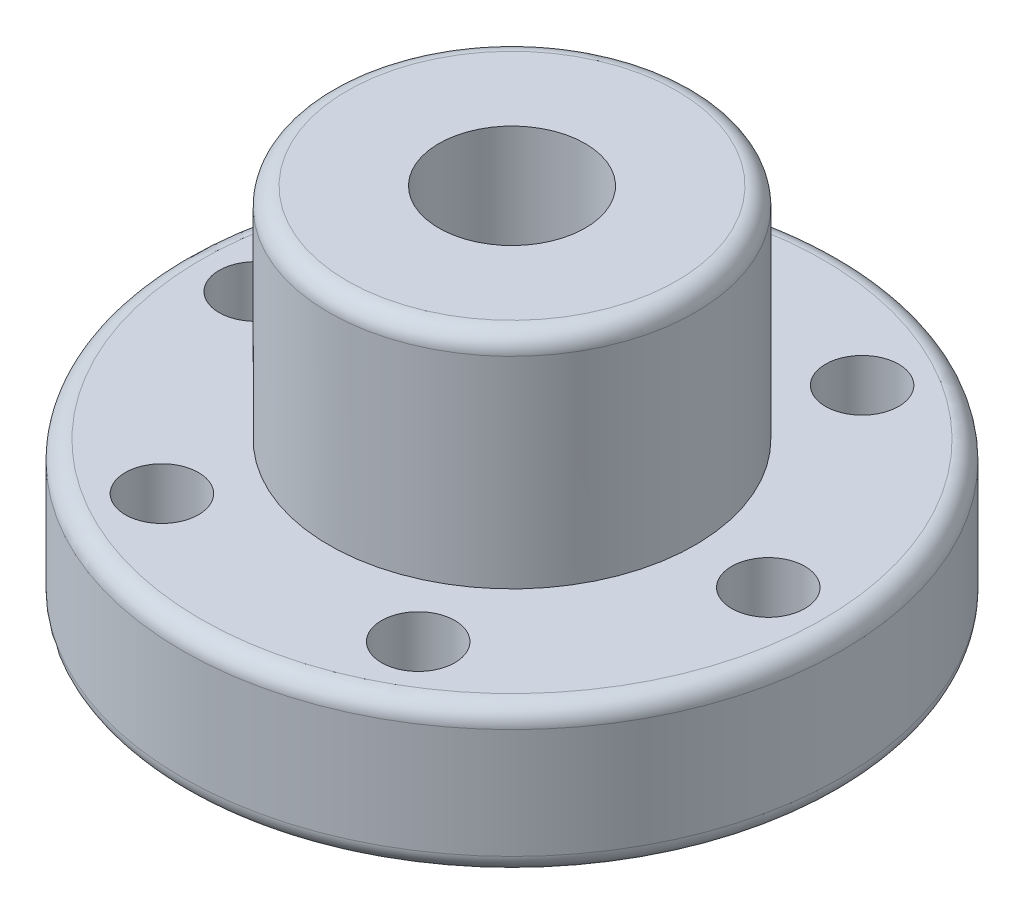
ISO-10303-21;
HEADER;
FILE_DESCRIPTION(('STEP AP214'),'2;1');
FILE_NAME('part.step','',(''),(''),'','','');
FILE_SCHEMA(('AUTOMOTIVE_DESIGN { 1 0 10303 214 1 1 1 1 }'));
ENDSEC;
DATA;
#1=APPLICATION_CONTEXT('core data for automotive mechanical design processes');
#2=APPLICATION_PROTOCOL_DEFINITION('international standard','automotive_design',2000,#1);
#3=PRODUCT_CONTEXT('',#1,'mechanical');
#4=PRODUCT('Part','Part','',(#3));
#5=PRODUCT_RELATED_PRODUCT_CATEGORY('part','',(#4));
#6=PRODUCT_DEFINITION_FORMATION('','',#4);
#7=PRODUCT_DEFINITION_CONTEXT('part definition',#1,'design');
#8=PRODUCT_DEFINITION('design','',#6,#7);
#9=PRODUCT_DEFINITION_SHAPE('','',#8);
#10=(LENGTH_UNIT() NAMED_UNIT(*) SI_UNIT(.MILLI.,.METRE.));
#11=(NAMED_UNIT(*) PLANE_ANGLE_UNIT() SI_UNIT($,.RADIAN.));
#12=(NAMED_UNIT(*) SI_UNIT($,.STERADIAN.) SOLID_ANGLE_UNIT());
#13=UNCERTAINTY_MEASURE_WITH_UNIT(LENGTH_MEASURE(1.E-05),#10,'distance_accuracy_value','');
#14=(GEOMETRIC_REPRESENTATION_CONTEXT(3) GLOBAL_UNCERTAINTY_ASSIGNED_CONTEXT((#13)) GLOBAL_UNIT_ASSIGNED_CONTEXT((#10,
#11,#12)) REPRESENTATION_CONTEXT('',''));
#15=CARTESIAN_POINT('',(0.,0.,0.));
#16=DIRECTION('',(0.,0.,1.));
#17=DIRECTION('',(1.,0.,0.));
#18=AXIS2_PLACEMENT_3D('',#15,#16,#17);
#19=CARTESIAN_POINT('',(14.,0.,0.));
#20=DIRECTION('',(0.,-1.,0.));
#21=DIRECTION('',(0.,0.,-1.));
#22=AXIS2_PLACEMENT_3D('',#19,#20,#21);
#23=PLANE('',#22);
#24=CARTESIAN_POINT('',(-11.,0.,12.1243556529822));
#25=DIRECTION('',(0.,-1.,0.));
#26=DIRECTION('',(0.,0.,-1.));
#27=AXIS2_PLACEMENT_3D('',#24,#25,#26);
#28=CIRCLE('',#27,2.);
#29=CARTESIAN_POINT('',(-11.,0.,10.1243556529822));
#30=VERTEX_POINT('',#29);
#31=EDGE_CURVE('E57',#30,#30,#28,.T.);
#32=ORIENTED_EDGE('',*,*,#31,.F.);
#33=EDGE_LOOP('',(#32));
#34=FACE_BOUND('',#33,.T.);
#35=CARTESIAN_POINT('',(3.00000000000006,0.,12.1243556529821));
#36=DIRECTION('',(0.,-1.,0.));
#37=DIRECTION('',(0.,0.,-1.));
#38=AXIS2_PLACEMENT_3D('',#35,#36,#37);
#39=CIRCLE('',#38,2.);
#40=CARTESIAN_POINT('',(3.00000000000006,0.,10.1243556529821));
#41=VERTEX_POINT('',#40);
#42=EDGE_CURVE('E250',#41,#41,#39,.T.);
#43=ORIENTED_EDGE('',*,*,#42,.F.);
#44=EDGE_LOOP('',(#43));
#45=FACE_BOUND('',#44,.T.);
#46=CARTESIAN_POINT('',(10.,0.,0.));
#47=DIRECTION('',(0.,-1.,0.));
#48=DIRECTION('',(0.,0.,-1.));
#49=AXIS2_PLACEMENT_3D('',#46,#47,#48);
#50=CIRCLE('',#49,2.);
#51=CARTESIAN_POINT('',(10.,0.,-2.0000000000001));
#52=VERTEX_POINT('',#51);
#53=EDGE_CURVE('E253',#52,#52,#50,.T.);
#54=ORIENTED_EDGE('',*,*,#53,.F.);
#55=EDGE_LOOP('',(#54));
#56=FACE_BOUND('',#55,.T.);
#57=CARTESIAN_POINT('',(2.99999999999988,0.,-12.1243556529822));
#58=DIRECTION('',(0.,-1.,0.));
#59=DIRECTION('',(0.,0.,-1.));
#60=AXIS2_PLACEMENT_3D('',#57,#58,#59);
#61=CIRCLE('',#60,2.00000000000001);
#62=CARTESIAN_POINT('',(2.99999999999988,0.,-14.1243556529822));
#63=VERTEX_POINT('',#62);
#64=EDGE_CURVE('E257',#63,#63,#61,.T.);
#65=ORIENTED_EDGE('',*,*,#64,.F.);
#66=EDGE_LOOP('',(#65));
#67=FACE_BOUND('',#66,.T.);
#68=CARTESIAN_POINT('',(-11.0000000000001,0.,-12.1243556529821));
#69=DIRECTION('',(0.,-1.,0.));
#70=DIRECTION('',(0.,0.,-1.));
#71=AXIS2_PLACEMENT_3D('',#68,#69,#70);
#72=CIRCLE('',#71,2.);
#73=CARTESIAN_POINT('',(-11.0000000000001,0.,-14.1243556529821));
#74=VERTEX_POINT('',#73);
#75=EDGE_CURVE('E75',#74,#74,#72,.T.);
#76=ORIENTED_EDGE('',*,*,#75,.F.);
#77=EDGE_LOOP('',(#76));
#78=FACE_BOUND('',#77,.T.);
#79=CARTESIAN_POINT('',(-18.,0.,0.));
#80=DIRECTION('',(0.,-1.,0.));
#81=DIRECTION('',(0.,0.,-1.));
#82=AXIS2_PLACEMENT_3D('',#79,#80,#81);
#83=CIRCLE('',#82,2.);
#84=CARTESIAN_POINT('',(-18.,0.,-2.));
#85=VERTEX_POINT('',#84);
#86=EDGE_CURVE('E52',#85,#85,#83,.T.);
#87=ORIENTED_EDGE('',*,*,#86,.F.);
#88=EDGE_LOOP('',(#87));
#89=FACE_BOUND('',#88,.T.);
#90=CARTESIAN_POINT('',(-4.,0.,0.));
#91=DIRECTION('',(0.,-1.,0.));
#92=DIRECTION('',(0.,0.,-1.));
#93=AXIS2_PLACEMENT_3D('',#90,#91,#92);
#94=CIRCLE('',#93,17.);
#95=CARTESIAN_POINT('',(-4.,0.,-17.));
#96=VERTEX_POINT('',#95);
#97=EDGE_CURVE('E91',#96,#96,#94,.T.);
#98=ORIENTED_EDGE('',*,*,#97,.T.);
#99=EDGE_LOOP('',(#98));
#100=FACE_BOUND('',#99,.T.);
#101=CARTESIAN_POINT('',(-4.,0.,0.));
#102=DIRECTION('',(0.,-1.,0.));
#103=DIRECTION('',(0.,0.,-1.));
#104=AXIS2_PLACEMENT_3D('',#101,#102,#103);
#105=CIRCLE('',#104,4.);
#106=CARTESIAN_POINT('',(-4.,0.,-4.));
#107=VERTEX_POINT('',#106);
#108=EDGE_CURVE('E82',#107,#107,#105,.T.);
#109=ORIENTED_EDGE('',*,*,#108,.F.);
#110=EDGE_LOOP('',(#109));
#111=FACE_BOUND('',#110,.T.);
#112=ADVANCED_FACE('F31',(#34,#45,#56,#67,#78,#89,#100,#111),#23,.T.);
#113=CARTESIAN_POINT('',(-4.,0.,0.));
#114=DIRECTION('',(0.,-1.,0.));
#115=DIRECTION('',(0.,0.,-1.));
#116=AXIS2_PLACEMENT_3D('',#113,#114,#115);
#117=CYLINDRICAL_SURFACE('',#116,4.);
#118=ORIENTED_EDGE('',*,*,#108,.T.);
#119=EDGE_LOOP('',(#118));
#120=FACE_BOUND('',#119,.T.);
#121=CARTESIAN_POINT('',(-4.,20.,0.));
#122=DIRECTION('',(0.,-1.,0.));
#123=DIRECTION('',(0.,0.,-1.));
#124=AXIS2_PLACEMENT_3D('',#121,#122,#123);
#125=CIRCLE('',#124,4.);
#126=CARTESIAN_POINT('',(-4.,20.,-4.));
#127=VERTEX_POINT('',#126);
#128=EDGE_CURVE('E79',#127,#127,#125,.T.);
#129=ORIENTED_EDGE('',*,*,#128,.F.);
#130=EDGE_LOOP('',(#129));
#131=FACE_BOUND('',#130,.T.);
#132=ADVANCED_FACE('F112',(#120,#131),#117,.F.);
#133=CARTESIAN_POINT('',(0.,20.,0.));
#134=DIRECTION('',(0.,1.,0.));
#135=DIRECTION('',(0.,0.,1.));
#136=AXIS2_PLACEMENT_3D('',#133,#134,#135);
#137=PLANE('',#136);
#138=CARTESIAN_POINT('',(-4.,20.,0.));
#139=DIRECTION('',(0.,1.,0.));
#140=DIRECTION('',(0.,0.,1.));
#141=AXIS2_PLACEMENT_3D('',#138,#139,#140);
#142=CIRCLE('',#141,9.);
#143=CARTESIAN_POINT('',(-4.,20.,9.));
#144=VERTEX_POINT('',#143);
#145=EDGE_CURVE('E88',#144,#144,#142,.T.);
#146=ORIENTED_EDGE('',*,*,#145,.T.);
#147=EDGE_LOOP('',(#146));
#148=FACE_BOUND('',#147,.T.);
#149=ORIENTED_EDGE('',*,*,#128,.T.);
#150=EDGE_LOOP('',(#149));
#151=FACE_BOUND('',#150,.T.);
#152=ADVANCED_FACE('F118',(#148,#151),#137,.T.);
#153=CARTESIAN_POINT('',(-4.,0.,0.));
#154=DIRECTION('',(0.,-1.,0.));
#155=DIRECTION('',(0.,0.,-1.));
#156=AXIS2_PLACEMENT_3D('',#153,#154,#155);
#157=CYLINDRICAL_SURFACE('',#156,10.);
#158=CARTESIAN_POINT('',(-4.,19.,0.));
#159=DIRECTION('',(0.,1.,0.));
#160=DIRECTION('',(0.,0.,1.));
#161=AXIS2_PLACEMENT_3D('',#158,#159,#160);
#162=CIRCLE('',#161,10.);
#163=CARTESIAN_POINT('',(-4.,19.,10.));
#164=VERTEX_POINT('',#163);
#165=EDGE_CURVE('E85',#164,#164,#162,.F.);
#166=ORIENTED_EDGE('',*,*,#165,.T.);
#167=EDGE_LOOP('',(#166));
#168=FACE_BOUND('',#167,.T.);
#169=CARTESIAN_POINT('',(-4.,8.,0.));
#170=DIRECTION('',(0.,-1.,0.));
#171=DIRECTION('',(0.,0.,-1.));
#172=AXIS2_PLACEMENT_3D('',#169,#170,#171);
#173=CIRCLE('',#172,10.);
#174=CARTESIAN_POINT('',(-4.,8.,-10.));
#175=VERTEX_POINT('',#174);
#176=EDGE_CURVE('E51',#175,#175,#173,.T.);
#177=ORIENTED_EDGE('',*,*,#176,.F.);
#178=EDGE_LOOP('',(#177));
#179=FACE_BOUND('',#178,.T.);
#180=ADVANCED_FACE('F137',(#168,#179),#157,.T.);
#181=CARTESIAN_POINT('',(6.,8.,0.));
#182=DIRECTION('',(0.,1.,0.));
#183=DIRECTION('',(0.,0.,1.));
#184=AXIS2_PLACEMENT_3D('',#181,#182,#183);
#185=PLANE('',#184);
#186=CARTESIAN_POINT('',(-11.,8.,12.1243556529822));
#187=DIRECTION('',(0.,1.,0.));
#188=DIRECTION('',(0.,0.,1.));
#189=AXIS2_PLACEMENT_3D('',#186,#187,#188);
#190=CIRCLE('',#189,2.);
#191=CARTESIAN_POINT('',(-11.,8.,14.1243556529822));
#192=VERTEX_POINT('',#191);
#193=EDGE_CURVE('E35',#192,#192,#190,.T.);
#194=ORIENTED_EDGE('',*,*,#193,.F.);
#195=EDGE_LOOP('',(#194));
#196=FACE_BOUND('',#195,.T.);
#197=CARTESIAN_POINT('',(3.00000000000006,8.,12.1243556529821));
#198=DIRECTION('',(0.,1.,0.));
#199=DIRECTION('',(0.,0.,1.));
#200=AXIS2_PLACEMENT_3D('',#197,#198,#199);
#201=CIRCLE('',#200,2.);
#202=CARTESIAN_POINT('',(3.00000000000006,8.,14.1243556529821));
#203=VERTEX_POINT('',#202);
#204=EDGE_CURVE('E62',#203,#203,#201,.T.);
#205=ORIENTED_EDGE('',*,*,#204,.F.);
#206=EDGE_LOOP('',(#205));
#207=FACE_BOUND('',#206,.T.);
#208=CARTESIAN_POINT('',(10.,8.,0.));
#209=DIRECTION('',(0.,1.,0.));
#210=DIRECTION('',(0.,0.,1.));
#211=AXIS2_PLACEMENT_3D('',#208,#209,#210);
#212=CIRCLE('',#211,2.);
#213=CARTESIAN_POINT('',(10.,8.,1.9999999999999));
#214=VERTEX_POINT('',#213);
#215=EDGE_CURVE('E60',#214,#214,#212,.T.);
#216=ORIENTED_EDGE('',*,*,#215,.F.);
#217=EDGE_LOOP('',(#216));
#218=FACE_BOUND('',#217,.T.);
#219=CARTESIAN_POINT('',(2.99999999999988,8.,-12.1243556529822));
#220=DIRECTION('',(0.,1.,0.));
#221=DIRECTION('',(0.,0.,1.));
#222=AXIS2_PLACEMENT_3D('',#219,#220,#221);
#223=CIRCLE('',#222,2.00000000000001);
#224=CARTESIAN_POINT('',(2.99999999999988,8.,-10.1243556529822));
#225=VERTEX_POINT('',#224);
#226=EDGE_CURVE('E56',#225,#225,#223,.T.);
#227=ORIENTED_EDGE('',*,*,#226,.F.);
#228=EDGE_LOOP('',(#227));
#229=FACE_BOUND('',#228,.T.);
#230=CARTESIAN_POINT('',(-11.0000000000001,8.,-12.1243556529821));
#231=DIRECTION('',(0.,1.,0.));
#232=DIRECTION('',(0.,0.,1.));
#233=AXIS2_PLACEMENT_3D('',#230,#231,#232);
#234=CIRCLE('',#233,2.);
#235=CARTESIAN_POINT('',(-11.0000000000001,8.,-10.1243556529821));
#236=VERTEX_POINT('',#235);
#237=EDGE_CURVE('E53',#236,#236,#234,.T.);
#238=ORIENTED_EDGE('',*,*,#237,.F.);
#239=EDGE_LOOP('',(#238));
#240=FACE_BOUND('',#239,.T.);
#241=CARTESIAN_POINT('',(-18.,8.,0.));
#242=DIRECTION('',(0.,1.,0.));
#243=DIRECTION('',(0.,0.,1.));
#244=AXIS2_PLACEMENT_3D('',#241,#242,#243);
#245=CIRCLE('',#244,2.);
#246=CARTESIAN_POINT('',(-18.,8.,2.));
#247=VERTEX_POINT('',#246);
#248=EDGE_CURVE('E48',#247,#247,#245,.T.);
#249=ORIENTED_EDGE('',*,*,#248,.F.);
#250=EDGE_LOOP('',(#249));
#251=FACE_BOUND('',#250,.T.);
#252=CARTESIAN_POINT('',(-4.,8.,0.));
#253=DIRECTION('',(0.,1.,0.));
#254=DIRECTION('',(0.,0.,1.));
#255=AXIS2_PLACEMENT_3D('',#252,#253,#254);
#256=CIRCLE('',#255,17.);
#257=CARTESIAN_POINT('',(-4.,8.,17.));
#258=VERTEX_POINT('',#257);
#259=EDGE_CURVE('E10',#258,#258,#256,.T.);
#260=ORIENTED_EDGE('',*,*,#259,.T.);
#261=EDGE_LOOP('',(#260));
#262=FACE_BOUND('',#261,.T.);
#263=ORIENTED_EDGE('',*,*,#176,.T.);
#264=EDGE_LOOP('',(#263));
#265=FACE_BOUND('',#264,.T.);
#266=ADVANCED_FACE('F130',(#196,#207,#218,#229,#240,#251,#262,#265),#185,.T.);
#267=CARTESIAN_POINT('',(-4.,0.,0.));
#268=DIRECTION('',(0.,-1.,0.));
#269=DIRECTION('',(0.,0.,-1.));
#270=AXIS2_PLACEMENT_3D('',#267,#268,#269);
#271=CYLINDRICAL_SURFACE('',#270,18.);
#272=CARTESIAN_POINT('',(-4.,0.999999999999999,0.));
#273=DIRECTION('',(0.,-1.,0.));
#274=DIRECTION('',(0.,0.,-1.));
#275=AXIS2_PLACEMENT_3D('',#272,#273,#274);
#276=CIRCLE('',#275,18.);
#277=CARTESIAN_POINT('',(-4.,0.999999999999999,-18.));
#278=VERTEX_POINT('',#277);
#279=EDGE_CURVE('E39',#278,#278,#276,.F.);
#280=ORIENTED_EDGE('',*,*,#279,.T.);
#281=EDGE_LOOP('',(#280));
#282=FACE_BOUND('',#281,.T.);
#283=CARTESIAN_POINT('',(-4.,7.,0.));
#284=DIRECTION('',(0.,1.,0.));
#285=DIRECTION('',(0.,0.,1.));
#286=AXIS2_PLACEMENT_3D('',#283,#284,#285);
#287=CIRCLE('',#286,18.);
#288=CARTESIAN_POINT('',(-4.,7.,18.));
#289=VERTEX_POINT('',#288);
#290=EDGE_CURVE('E44',#289,#289,#287,.F.);
#291=ORIENTED_EDGE('',*,*,#290,.T.);
#292=EDGE_LOOP('',(#291));
#293=FACE_BOUND('',#292,.T.);
#294=ADVANCED_FACE('F96',(#282,#293),#271,.T.);
#295=CARTESIAN_POINT('',(-4.,19.,0.));
#296=DIRECTION('',(0.,1.,0.));
#297=DIRECTION('',(0.,0.,1.));
#298=AXIS2_PLACEMENT_3D('',#295,#296,#297);
#299=TOROIDAL_SURFACE('',#298,9.,1.);
#300=ORIENTED_EDGE('',*,*,#145,.F.);
#301=EDGE_LOOP('',(#300));
#302=FACE_BOUND('',#301,.T.);
#303=ORIENTED_EDGE('',*,*,#165,.F.);
#304=EDGE_LOOP('',(#303));
#305=FACE_BOUND('',#304,.T.);
#306=ADVANCED_FACE('F109',(#302,#305),#299,.T.);
#307=CARTESIAN_POINT('',(-4.,0.999999999999999,0.));
#308=DIRECTION('',(0.,-1.,0.));
#309=DIRECTION('',(0.,0.,-1.));
#310=AXIS2_PLACEMENT_3D('',#307,#308,#309);
#311=TOROIDAL_SURFACE('',#310,17.,1.);
#312=ORIENTED_EDGE('',*,*,#279,.F.);
#313=EDGE_LOOP('',(#312));
#314=FACE_BOUND('',#313,.T.);
#315=ORIENTED_EDGE('',*,*,#97,.F.);
#316=EDGE_LOOP('',(#315));
#317=FACE_BOUND('',#316,.T.);
#318=ADVANCED_FACE('F100',(#314,#317),#311,.T.);
#319=CARTESIAN_POINT('',(-4.,7.,0.));
#320=DIRECTION('',(0.,1.,0.));
#321=DIRECTION('',(0.,0.,1.));
#322=AXIS2_PLACEMENT_3D('',#319,#320,#321);
#323=TOROIDAL_SURFACE('',#322,17.,1.);
#324=ORIENTED_EDGE('',*,*,#259,.F.);
#325=EDGE_LOOP('',(#324));
#326=FACE_BOUND('',#325,.T.);
#327=ORIENTED_EDGE('',*,*,#290,.F.);
#328=EDGE_LOOP('',(#327));
#329=FACE_BOUND('',#328,.T.);
#330=ADVANCED_FACE('F33',(#326,#329),#323,.T.);
#331=CARTESIAN_POINT('',(-18.,10.,0.));
#332=DIRECTION('',(0.,-1.,0.));
#333=DIRECTION('',(0.,0.,-1.));
#334=AXIS2_PLACEMENT_3D('',#331,#332,#333);
#335=CYLINDRICAL_SURFACE('',#334,2.);
#336=ORIENTED_EDGE('',*,*,#248,.T.);
#337=EDGE_LOOP('',(#336));
#338=FACE_BOUND('',#337,.T.);
#339=ORIENTED_EDGE('',*,*,#86,.T.);
#340=EDGE_LOOP('',(#339));
#341=FACE_BOUND('',#340,.T.);
#342=ADVANCED_FACE('F99',(#338,#341),#335,.F.);
#343=CARTESIAN_POINT('',(-11.0000000000001,10.,-12.1243556529821));
#344=DIRECTION('',(0.,-1.,0.));
#345=DIRECTION('',(0.,0.,-1.));
#346=AXIS2_PLACEMENT_3D('',#343,#344,#345);
#347=CYLINDRICAL_SURFACE('',#346,2.);
#348=ORIENTED_EDGE('',*,*,#237,.T.);
#349=EDGE_LOOP('',(#348));
#350=FACE_BOUND('',#349,.T.);
#351=ORIENTED_EDGE('',*,*,#75,.T.);
#352=EDGE_LOOP('',(#351));
#353=FACE_BOUND('',#352,.T.);
#354=ADVANCED_FACE('F106',(#350,#353),#347,.F.);
#355=CARTESIAN_POINT('',(2.99999999999988,10.,-12.1243556529822));
#356=DIRECTION('',(0.,-1.,0.));
#357=DIRECTION('',(0.,0.,-1.));
#358=AXIS2_PLACEMENT_3D('',#355,#356,#357);
#359=CYLINDRICAL_SURFACE('',#358,2.00000000000001);
#360=ORIENTED_EDGE('',*,*,#226,.T.);
#361=EDGE_LOOP('',(#360));
#362=FACE_BOUND('',#361,.T.);
#363=ORIENTED_EDGE('',*,*,#64,.T.);
#364=EDGE_LOOP('',(#363));
#365=FACE_BOUND('',#364,.T.);
#366=ADVANCED_FACE('F206',(#362,#365),#359,.F.);
#367=CARTESIAN_POINT('',(10.,10.,0.));
#368=DIRECTION('',(0.,-1.,0.));
#369=DIRECTION('',(0.,0.,-1.));
#370=AXIS2_PLACEMENT_3D('',#367,#368,#369);
#371=CYLINDRICAL_SURFACE('',#370,2.);
#372=ORIENTED_EDGE('',*,*,#215,.T.);
#373=EDGE_LOOP('',(#372));
#374=FACE_BOUND('',#373,.T.);
#375=ORIENTED_EDGE('',*,*,#53,.T.);
#376=EDGE_LOOP('',(#375));
#377=FACE_BOUND('',#376,.T.);
#378=ADVANCED_FACE('F216',(#374,#377),#371,.F.);
#379=CARTESIAN_POINT('',(3.00000000000006,10.,12.1243556529821));
#380=DIRECTION('',(0.,-1.,0.));
#381=DIRECTION('',(0.,0.,-1.));
#382=AXIS2_PLACEMENT_3D('',#379,#380,#381);
#383=CYLINDRICAL_SURFACE('',#382,2.);
#384=ORIENTED_EDGE('',*,*,#204,.T.);
#385=EDGE_LOOP('',(#384));
#386=FACE_BOUND('',#385,.T.);
#387=ORIENTED_EDGE('',*,*,#42,.T.);
#388=EDGE_LOOP('',(#387));
#389=FACE_BOUND('',#388,.T.);
#390=ADVANCED_FACE('F226',(#386,#389),#383,.F.);
#391=CARTESIAN_POINT('',(-11.,10.,12.1243556529822));
#392=DIRECTION('',(0.,-1.,0.));
#393=DIRECTION('',(0.,0.,-1.));
#394=AXIS2_PLACEMENT_3D('',#391,#392,#393);
#395=CYLINDRICAL_SURFACE('',#394,2.);
#396=ORIENTED_EDGE('',*,*,#193,.T.);
#397=EDGE_LOOP('',(#396));
#398=FACE_BOUND('',#397,.T.);
#399=ORIENTED_EDGE('',*,*,#31,.T.);
#400=EDGE_LOOP('',(#399));
#401=FACE_BOUND('',#400,.T.);
#402=ADVANCED_FACE('F236',(#398,#401),#395,.F.);
#403=CLOSED_SHELL('',(#112,#132,#152,#180,#266,#294,#306,#318,#330,#342,#354,#366,#378,#390,#402));
#404=MANIFOLD_SOLID_BREP('B2',#403);
#405=ADVANCED_BREP_SHAPE_REPRESENTATION('',(#18,#404),#14);
#406=SHAPE_DEFINITION_REPRESENTATION(#9,#405);
ENDSEC;
END-ISO-10303-21;
